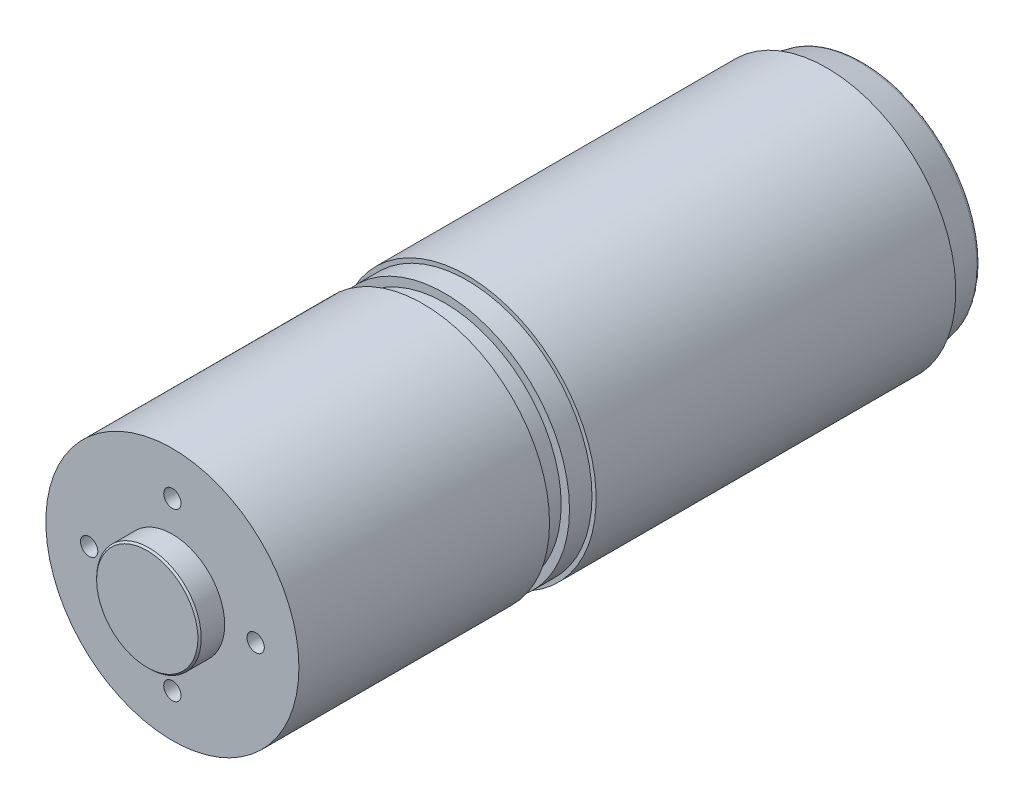
ISO-10303-21;
HEADER;
FILE_DESCRIPTION(('STEP AP214'),'2;1');
FILE_NAME('part.step','',(''),(''),'','','');
FILE_SCHEMA(('AUTOMOTIVE_DESIGN { 1 0 10303 214 1 1 1 1 }'));
ENDSEC;
DATA;
#1=APPLICATION_CONTEXT('core data for automotive mechanical design processes');
#2=APPLICATION_PROTOCOL_DEFINITION('international standard','automotive_design',2000,#1);
#3=PRODUCT_CONTEXT('',#1,'mechanical');
#4=PRODUCT('Part','Part','',(#3));
#5=PRODUCT_RELATED_PRODUCT_CATEGORY('part','',(#4));
#6=PRODUCT_DEFINITION_FORMATION('','',#4);
#7=PRODUCT_DEFINITION_CONTEXT('part definition',#1,'design');
#8=PRODUCT_DEFINITION('design','',#6,#7);
#9=PRODUCT_DEFINITION_SHAPE('','',#8);
#10=(LENGTH_UNIT() NAMED_UNIT(*) SI_UNIT(.MILLI.,.METRE.));
#11=(NAMED_UNIT(*) PLANE_ANGLE_UNIT() SI_UNIT($,.RADIAN.));
#12=(NAMED_UNIT(*) SI_UNIT($,.STERADIAN.) SOLID_ANGLE_UNIT());
#13=UNCERTAINTY_MEASURE_WITH_UNIT(LENGTH_MEASURE(1.E-05),#10,'distance_accuracy_value','');
#14=(GEOMETRIC_REPRESENTATION_CONTEXT(3) GLOBAL_UNCERTAINTY_ASSIGNED_CONTEXT((#13)) GLOBAL_UNIT_ASSIGNED_CONTEXT((#10,
#11,#12)) REPRESENTATION_CONTEXT('',''));
#15=CARTESIAN_POINT('',(0.,0.,0.));
#16=DIRECTION('',(0.,0.,1.));
#17=DIRECTION('',(1.,0.,0.));
#18=AXIS2_PLACEMENT_3D('',#15,#16,#17);
#19=CARTESIAN_POINT('',(0.,0.,42.0624));
#20=DIRECTION('',(0.,0.,-1.));
#21=DIRECTION('',(-1.,0.,0.));
#22=AXIS2_PLACEMENT_3D('',#19,#20,#21);
#23=PLANE('',#22);
#24=CARTESIAN_POINT('',(0.,0.,42.062400000114));
#25=DIRECTION('',(0.,0.,-1.));
#26=DIRECTION('',(-1.,0.,0.));
#27=AXIS2_PLACEMENT_3D('',#24,#25,#26);
#28=CIRCLE('',#27,7.72160000011398);
#29=CARTESIAN_POINT('',(-7.72160000011398,0.,42.062400000114));
#30=VERTEX_POINT('',#29);
#31=EDGE_CURVE('E162',#30,#30,#28,.T.);
#32=ORIENTED_EDGE('',*,*,#31,.F.);
#33=EDGE_LOOP('',(#32));
#34=FACE_BOUND('',#33,.T.);
#35=ADVANCED_FACE('F18',(#34),#23,.F.);
#36=CARTESIAN_POINT('',(12.7,0.,31.877));
#37=DIRECTION('',(0.,0.,1.));
#38=DIRECTION('',(1.,0.,0.));
#39=AXIS2_PLACEMENT_3D('',#36,#37,#38);
#40=CONICAL_SURFACE('',#39,1.3208,1.02974425867665);
#41=CARTESIAN_POINT('',(12.7,0.,31.877));
#42=DIRECTION('',(0.,0.,1.));
#43=DIRECTION('',(1.,0.,0.));
#44=AXIS2_PLACEMENT_3D('',#41,#42,#43);
#45=CIRCLE('',#44,1.3208);
#46=CARTESIAN_POINT('',(14.0208,0.,31.877));
#47=VERTEX_POINT('',#46);
#48=EDGE_CURVE('E161',#47,#47,#45,.T.);
#49=ORIENTED_EDGE('',*,*,#48,.T.);
#50=EDGE_LOOP('',(#49));
#51=FACE_BOUND('',#50,.T.);
#52=CARTESIAN_POINT('',(12.7,0.,31.0833832943884));
#53=VERTEX_POINT('',#52);
#54=VERTEX_LOOP('',#53);
#55=FACE_BOUND('',#54,.T.);
#56=ADVANCED_FACE('F52',(#51,#55),#40,.F.);
#57=CARTESIAN_POINT('',(0.,-12.7,31.877));
#58=DIRECTION('',(0.,0.,1.));
#59=DIRECTION('',(0.,-1.,0.));
#60=AXIS2_PLACEMENT_3D('',#57,#58,#59);
#61=CONICAL_SURFACE('',#60,1.3208,1.02974425867665);
#62=CARTESIAN_POINT('',(0.,-12.7,31.877));
#63=DIRECTION('',(0.,0.,1.));
#64=DIRECTION('',(0.,-1.,0.));
#65=AXIS2_PLACEMENT_3D('',#62,#63,#64);
#66=CIRCLE('',#65,1.3208);
#67=CARTESIAN_POINT('',(0.,-14.0208,31.877));
#68=VERTEX_POINT('',#67);
#69=EDGE_CURVE('E158',#68,#68,#66,.T.);
#70=ORIENTED_EDGE('',*,*,#69,.T.);
#71=EDGE_LOOP('',(#70));
#72=FACE_BOUND('',#71,.T.);
#73=CARTESIAN_POINT('',(0.,-12.7,31.0833832943884));
#74=VERTEX_POINT('',#73);
#75=VERTEX_LOOP('',#74);
#76=FACE_BOUND('',#75,.T.);
#77=ADVANCED_FACE('F54',(#72,#76),#61,.F.);
#78=CARTESIAN_POINT('',(-12.7,0.,31.877));
#79=DIRECTION('',(0.,0.,1.));
#80=DIRECTION('',(1.,0.,0.));
#81=AXIS2_PLACEMENT_3D('',#78,#79,#80);
#82=CONICAL_SURFACE('',#81,1.3208,1.02974425867665);
#83=CARTESIAN_POINT('',(-12.7,0.,31.877));
#84=DIRECTION('',(0.,0.,1.));
#85=DIRECTION('',(1.,0.,0.));
#86=AXIS2_PLACEMENT_3D('',#83,#84,#85);
#87=CIRCLE('',#86,1.3208);
#88=CARTESIAN_POINT('',(-11.3792,0.,31.877));
#89=VERTEX_POINT('',#88);
#90=EDGE_CURVE('E155',#89,#89,#87,.T.);
#91=ORIENTED_EDGE('',*,*,#90,.T.);
#92=EDGE_LOOP('',(#91));
#93=FACE_BOUND('',#92,.T.);
#94=CARTESIAN_POINT('',(-12.7,0.,31.0833832943884));
#95=VERTEX_POINT('',#94);
#96=VERTEX_LOOP('',#95);
#97=FACE_BOUND('',#96,.T.);
#98=ADVANCED_FACE('F62',(#93,#97),#82,.F.);
#99=CARTESIAN_POINT('',(0.,12.7,31.877));
#100=DIRECTION('',(0.,0.,1.));
#101=DIRECTION('',(1.,0.,0.));
#102=AXIS2_PLACEMENT_3D('',#99,#100,#101);
#103=CONICAL_SURFACE('',#102,1.3208,1.02974425867665);
#104=CARTESIAN_POINT('',(0.,12.7,31.877));
#105=DIRECTION('',(0.,0.,1.));
#106=DIRECTION('',(1.,0.,0.));
#107=AXIS2_PLACEMENT_3D('',#104,#105,#106);
#108=CIRCLE('',#107,1.3208);
#109=CARTESIAN_POINT('',(1.3208,12.7,31.877));
#110=VERTEX_POINT('',#109);
#111=EDGE_CURVE('E152',#110,#110,#108,.T.);
#112=ORIENTED_EDGE('',*,*,#111,.T.);
#113=EDGE_LOOP('',(#112));
#114=FACE_BOUND('',#113,.T.);
#115=CARTESIAN_POINT('',(0.,12.7,31.0833832943884));
#116=VERTEX_POINT('',#115);
#117=VERTEX_LOOP('',#116);
#118=FACE_BOUND('',#117,.T.);
#119=ADVANCED_FACE('F366',(#114,#118),#103,.F.);
#120=CARTESIAN_POINT('',(0.,0.,41.808399999886));
#121=DIRECTION('',(0.,0.,-1.));
#122=DIRECTION('',(-1.,0.,0.));
#123=AXIS2_PLACEMENT_3D('',#120,#121,#122);
#124=CONICAL_SURFACE('',#123,7.97559999988603,0.785398162499995);
#125=CARTESIAN_POINT('',(0.,0.,41.8084));
#126=DIRECTION('',(0.,0.,1.));
#127=DIRECTION('',(1.,0.,0.));
#128=AXIS2_PLACEMENT_3D('',#125,#126,#127);
#129=CIRCLE('',#128,7.9756);
#130=CARTESIAN_POINT('',(7.9756,0.,41.8084));
#131=VERTEX_POINT('',#130);
#132=EDGE_CURVE('E143',#131,#131,#129,.F.);
#133=ORIENTED_EDGE('',*,*,#132,.F.);
#134=EDGE_LOOP('',(#133));
#135=FACE_BOUND('',#134,.T.);
#136=ORIENTED_EDGE('',*,*,#31,.T.);
#137=EDGE_LOOP('',(#136));
#138=FACE_BOUND('',#137,.T.);
#139=ADVANCED_FACE('F357',(#135,#138),#124,.T.);
#140=CARTESIAN_POINT('',(12.7,0.,38.227));
#141=DIRECTION('',(0.,0.,-1.));
#142=DIRECTION('',(-1.,0.,0.));
#143=AXIS2_PLACEMENT_3D('',#140,#141,#142);
#144=CYLINDRICAL_SURFACE('',#143,1.3208);
#145=ORIENTED_EDGE('',*,*,#48,.F.);
#146=EDGE_LOOP('',(#145));
#147=FACE_BOUND('',#146,.T.);
#148=CARTESIAN_POINT('',(12.7,0.,38.227));
#149=DIRECTION('',(0.,0.,-1.));
#150=DIRECTION('',(-1.,0.,0.));
#151=AXIS2_PLACEMENT_3D('',#148,#149,#150);
#152=CIRCLE('',#151,1.3208);
#153=CARTESIAN_POINT('',(11.3792,0.,38.227));
#154=VERTEX_POINT('',#153);
#155=EDGE_CURVE('E151',#154,#154,#152,.F.);
#156=ORIENTED_EDGE('',*,*,#155,.T.);
#157=EDGE_LOOP('',(#156));
#158=FACE_BOUND('',#157,.T.);
#159=ADVANCED_FACE('F348',(#147,#158),#144,.F.);
#160=CARTESIAN_POINT('',(0.,-12.7,38.227));
#161=DIRECTION('',(0.,0.,-1.));
#162=DIRECTION('',(-1.,0.,0.));
#163=AXIS2_PLACEMENT_3D('',#160,#161,#162);
#164=CYLINDRICAL_SURFACE('',#163,1.3208);
#165=ORIENTED_EDGE('',*,*,#69,.F.);
#166=EDGE_LOOP('',(#165));
#167=FACE_BOUND('',#166,.T.);
#168=CARTESIAN_POINT('',(0.,-12.7,38.227));
#169=DIRECTION('',(0.,0.,-1.));
#170=DIRECTION('',(-1.,0.,0.));
#171=AXIS2_PLACEMENT_3D('',#168,#169,#170);
#172=CIRCLE('',#171,1.3208);
#173=CARTESIAN_POINT('',(-1.3208,-12.7,38.227));
#174=VERTEX_POINT('',#173);
#175=EDGE_CURVE('E193',#174,#174,#172,.F.);
#176=ORIENTED_EDGE('',*,*,#175,.T.);
#177=EDGE_LOOP('',(#176));
#178=FACE_BOUND('',#177,.T.);
#179=ADVANCED_FACE('F340',(#167,#178),#164,.F.);
#180=CARTESIAN_POINT('',(-12.7,0.,38.227));
#181=DIRECTION('',(0.,0.,-1.));
#182=DIRECTION('',(-1.,0.,0.));
#183=AXIS2_PLACEMENT_3D('',#180,#181,#182);
#184=CYLINDRICAL_SURFACE('',#183,1.3208);
#185=ORIENTED_EDGE('',*,*,#90,.F.);
#186=EDGE_LOOP('',(#185));
#187=FACE_BOUND('',#186,.T.);
#188=CARTESIAN_POINT('',(-12.7,0.,38.227));
#189=DIRECTION('',(0.,0.,-1.));
#190=DIRECTION('',(-1.,0.,0.));
#191=AXIS2_PLACEMENT_3D('',#188,#189,#190);
#192=CIRCLE('',#191,1.3208);
#193=CARTESIAN_POINT('',(-14.0208,0.,38.227));
#194=VERTEX_POINT('',#193);
#195=EDGE_CURVE('E190',#194,#194,#192,.F.);
#196=ORIENTED_EDGE('',*,*,#195,.T.);
#197=EDGE_LOOP('',(#196));
#198=FACE_BOUND('',#197,.T.);
#199=ADVANCED_FACE('F332',(#187,#198),#184,.F.);
#200=CARTESIAN_POINT('',(0.,12.7,38.227));
#201=DIRECTION('',(0.,0.,-1.));
#202=DIRECTION('',(-1.,0.,0.));
#203=AXIS2_PLACEMENT_3D('',#200,#201,#202);
#204=CYLINDRICAL_SURFACE('',#203,1.3208);
#205=ORIENTED_EDGE('',*,*,#111,.F.);
#206=EDGE_LOOP('',(#205));
#207=FACE_BOUND('',#206,.T.);
#208=CARTESIAN_POINT('',(0.,12.7,38.227));
#209=DIRECTION('',(0.,0.,-1.));
#210=DIRECTION('',(-1.,0.,0.));
#211=AXIS2_PLACEMENT_3D('',#208,#209,#210);
#212=CIRCLE('',#211,1.3208);
#213=CARTESIAN_POINT('',(-1.3208,12.7,38.227));
#214=VERTEX_POINT('',#213);
#215=EDGE_CURVE('E187',#214,#214,#212,.F.);
#216=ORIENTED_EDGE('',*,*,#215,.T.);
#217=EDGE_LOOP('',(#216));
#218=FACE_BOUND('',#217,.T.);
#219=ADVANCED_FACE('F20',(#207,#218),#204,.F.);
#220=CARTESIAN_POINT('',(0.,0.,38.227));
#221=DIRECTION('',(0.,0.,1.));
#222=DIRECTION('',(1.,0.,0.));
#223=AXIS2_PLACEMENT_3D('',#220,#221,#222);
#224=CYLINDRICAL_SURFACE('',#223,7.9756);
#225=CARTESIAN_POINT('',(0.,0.,38.227));
#226=DIRECTION('',(0.,0.,1.));
#227=DIRECTION('',(1.,0.,0.));
#228=AXIS2_PLACEMENT_3D('',#225,#226,#227);
#229=CIRCLE('',#228,7.9756);
#230=CARTESIAN_POINT('',(7.9756,0.,38.227));
#231=VERTEX_POINT('',#230);
#232=EDGE_CURVE('E184',#231,#231,#229,.T.);
#233=ORIENTED_EDGE('',*,*,#232,.T.);
#234=EDGE_LOOP('',(#233));
#235=FACE_BOUND('',#234,.T.);
#236=ORIENTED_EDGE('',*,*,#132,.T.);
#237=EDGE_LOOP('',(#236));
#238=FACE_BOUND('',#237,.T.);
#239=ADVANCED_FACE('F315',(#235,#238),#224,.T.);
#240=CARTESIAN_POINT('',(0.,0.,38.227));
#241=DIRECTION('',(0.,0.,-1.));
#242=DIRECTION('',(-1.,0.,0.));
#243=AXIS2_PLACEMENT_3D('',#240,#241,#242);
#244=PLANE('',#243);
#245=ORIENTED_EDGE('',*,*,#232,.F.);
#246=EDGE_LOOP('',(#245));
#247=FACE_BOUND('',#246,.T.);
#248=ORIENTED_EDGE('',*,*,#215,.F.);
#249=EDGE_LOOP('',(#248));
#250=FACE_BOUND('',#249,.T.);
#251=ORIENTED_EDGE('',*,*,#195,.F.);
#252=EDGE_LOOP('',(#251));
#253=FACE_BOUND('',#252,.T.);
#254=ORIENTED_EDGE('',*,*,#175,.F.);
#255=EDGE_LOOP('',(#254));
#256=FACE_BOUND('',#255,.T.);
#257=ORIENTED_EDGE('',*,*,#155,.F.);
#258=EDGE_LOOP('',(#257));
#259=FACE_BOUND('',#258,.T.);
#260=CARTESIAN_POINT('',(0.,0.,38.227));
#261=DIRECTION('',(0.,0.,1.));
#262=DIRECTION('',(1.,0.,0.));
#263=AXIS2_PLACEMENT_3D('',#260,#261,#262);
#264=CIRCLE('',#263,19.304);
#265=CARTESIAN_POINT('',(19.304,0.,38.227));
#266=VERTEX_POINT('',#265);
#267=EDGE_CURVE('E181',#266,#266,#264,.F.);
#268=ORIENTED_EDGE('',*,*,#267,.F.);
#269=EDGE_LOOP('',(#268));
#270=FACE_BOUND('',#269,.T.);
#271=ADVANCED_FACE('F306',(#247,#250,#253,#256,#259,#270),#244,.F.);
#272=CARTESIAN_POINT('',(0.,0.,0.));
#273=DIRECTION('',(0.,0.,1.));
#274=DIRECTION('',(1.,0.,0.));
#275=AXIS2_PLACEMENT_3D('',#272,#273,#274);
#276=CYLINDRICAL_SURFACE('',#275,19.304);
#277=ORIENTED_EDGE('',*,*,#267,.T.);
#278=EDGE_LOOP('',(#277));
#279=FACE_BOUND('',#278,.T.);
#280=CARTESIAN_POINT('',(0.,0.,0.));
#281=DIRECTION('',(0.,0.,1.));
#282=DIRECTION('',(1.,0.,0.));
#283=AXIS2_PLACEMENT_3D('',#280,#281,#282);
#284=CIRCLE('',#283,19.304);
#285=CARTESIAN_POINT('',(19.304,0.,0.));
#286=VERTEX_POINT('',#285);
#287=EDGE_CURVE('E178',#286,#286,#284,.F.);
#288=ORIENTED_EDGE('',*,*,#287,.F.);
#289=EDGE_LOOP('',(#288));
#290=FACE_BOUND('',#289,.T.);
#291=ADVANCED_FACE('F298',(#279,#290),#276,.T.);
#292=CARTESIAN_POINT('',(0.,0.,0.));
#293=DIRECTION('',(0.,0.,-1.));
#294=DIRECTION('',(-1.,0.,0.));
#295=AXIS2_PLACEMENT_3D('',#292,#293,#294);
#296=PLANE('',#295);
#297=CARTESIAN_POINT('',(0.,0.,0.));
#298=DIRECTION('',(0.,0.,-1.));
#299=DIRECTION('',(-1.,0.,0.));
#300=AXIS2_PLACEMENT_3D('',#297,#298,#299);
#301=CIRCLE('',#300,17.78);
#302=CARTESIAN_POINT('',(-17.78,0.,0.));
#303=VERTEX_POINT('',#302);
#304=EDGE_CURVE('E175',#303,#303,#301,.T.);
#305=ORIENTED_EDGE('',*,*,#304,.F.);
#306=EDGE_LOOP('',(#305));
#307=FACE_BOUND('',#306,.T.);
#308=ORIENTED_EDGE('',*,*,#287,.T.);
#309=EDGE_LOOP('',(#308));
#310=FACE_BOUND('',#309,.T.);
#311=ADVANCED_FACE('F290',(#307,#310),#296,.T.);
#312=CARTESIAN_POINT('',(0.,0.,0.));
#313=DIRECTION('',(0.,0.,-1.));
#314=DIRECTION('',(-1.,0.,0.));
#315=AXIS2_PLACEMENT_3D('',#312,#313,#314);
#316=CYLINDRICAL_SURFACE('',#315,17.78);
#317=CARTESIAN_POINT('',(0.,0.,-3.302));
#318=DIRECTION('',(0.,0.,-1.));
#319=DIRECTION('',(-1.,0.,0.));
#320=AXIS2_PLACEMENT_3D('',#317,#318,#319);
#321=CIRCLE('',#320,17.78);
#322=CARTESIAN_POINT('',(-17.78,0.,-3.302));
#323=VERTEX_POINT('',#322);
#324=EDGE_CURVE('E172',#323,#323,#321,.T.);
#325=ORIENTED_EDGE('',*,*,#324,.F.);
#326=EDGE_LOOP('',(#325));
#327=FACE_BOUND('',#326,.T.);
#328=ORIENTED_EDGE('',*,*,#304,.T.);
#329=EDGE_LOOP('',(#328));
#330=FACE_BOUND('',#329,.T.);
#331=ADVANCED_FACE('F128',(#327,#330),#316,.T.);
#332=CARTESIAN_POINT('',(0.,0.,-67.183));
#333=DIRECTION('',(0.,0.,1.));
#334=DIRECTION('',(1.,0.,0.));
#335=AXIS2_PLACEMENT_3D('',#332,#333,#334);
#336=PLANE('',#335);
#337=CARTESIAN_POINT('',(0.,0.,-67.183));
#338=DIRECTION('',(0.,0.,1.));
#339=DIRECTION('',(1.,0.,0.));
#340=AXIS2_PLACEMENT_3D('',#337,#338,#339);
#341=CIRCLE('',#340,17.1717498364017);
#342=CARTESIAN_POINT('',(17.1717498364017,0.,-67.183));
#343=VERTEX_POINT('',#342);
#344=CARTESIAN_POINT('',(-17.1717498364017,0.,-67.183));
#345=VERTEX_POINT('',#344);
#346=EDGE_CURVE('E38',#343,#345,#341,.T.);
#347=ORIENTED_EDGE('',*,*,#346,.F.);
#348=CARTESIAN_POINT('',(0.,0.,-67.183));
#349=DIRECTION('',(0.,0.,1.));
#350=DIRECTION('',(-1.,0.,0.));
#351=AXIS2_PLACEMENT_3D('',#348,#349,#350);
#352=CIRCLE('',#351,17.1717498364017);
#353=EDGE_CURVE('E139',#345,#343,#352,.T.);
#354=ORIENTED_EDGE('',*,*,#353,.F.);
#355=EDGE_LOOP('',(#347,#354));
#356=FACE_BOUND('',#355,.T.);
#357=ADVANCED_FACE('F119',(#356),#336,.F.);
#358=CARTESIAN_POINT('',(0.,0.,-3.302));
#359=DIRECTION('',(0.,0.,1.));
#360=DIRECTION('',(1.,0.,0.));
#361=AXIS2_PLACEMENT_3D('',#358,#359,#360);
#362=PLANE('',#361);
#363=ORIENTED_EDGE('',*,*,#324,.T.);
#364=EDGE_LOOP('',(#363));
#365=FACE_BOUND('',#364,.T.);
#366=CARTESIAN_POINT('',(0.,0.,-3.302));
#367=DIRECTION('',(0.,0.,-1.));
#368=DIRECTION('',(-1.,0.,0.));
#369=AXIS2_PLACEMENT_3D('',#366,#367,#368);
#370=CIRCLE('',#369,19.05);
#371=CARTESIAN_POINT('',(-19.05,0.,-3.302));
#372=VERTEX_POINT('',#371);
#373=EDGE_CURVE('E112',#372,#372,#370,.T.);
#374=ORIENTED_EDGE('',*,*,#373,.F.);
#375=EDGE_LOOP('',(#374));
#376=FACE_BOUND('',#375,.T.);
#377=ADVANCED_FACE('F101',(#365,#376),#362,.T.);
#378=CARTESIAN_POINT('',(0.,0.,-66.421));
#379=DIRECTION('',(0.,0.,1.));
#380=DIRECTION('',(1.,0.,0.));
#381=AXIS2_PLACEMENT_3D('',#378,#379,#380);
#382=TOROIDAL_SURFACE('',#381,17.1717498364017,0.762);
#383=CARTESIAN_POINT('',(0.,0.,-66.5898752810625));
#384=DIRECTION('',(0.,0.,1.));
#385=DIRECTION('',(1.,0.,0.));
#386=AXIS2_PLACEMENT_3D('',#383,#384,#385);
#387=CIRCLE('',#386,17.9148010730768);
#388=CARTESIAN_POINT('',(17.9148010730768,0.,-66.5898752810625));
#389=VERTEX_POINT('',#388);
#390=EDGE_CURVE('E108',#389,#389,#387,.T.);
#391=ORIENTED_EDGE('',*,*,#390,.F.);
#392=EDGE_LOOP('',(#391));
#393=FACE_BOUND('',#392,.T.);
#394=ORIENTED_EDGE('',*,*,#353,.T.);
#395=ORIENTED_EDGE('',*,*,#346,.T.);
#396=EDGE_LOOP('',(#394,#395));
#397=FACE_BOUND('',#396,.T.);
#398=ADVANCED_FACE('F95',(#393,#397),#382,.T.);
#399=CARTESIAN_POINT('',(0.,0.,-3.302));
#400=DIRECTION('',(0.,0.,-1.));
#401=DIRECTION('',(-1.,0.,0.));
#402=AXIS2_PLACEMENT_3D('',#399,#400,#401);
#403=CYLINDRICAL_SURFACE('',#402,19.05);
#404=CARTESIAN_POINT('',(0.,0.,-6.731));
#405=DIRECTION('',(0.,0.,-1.));
#406=DIRECTION('',(-1.,0.,0.));
#407=AXIS2_PLACEMENT_3D('',#404,#405,#406);
#408=CIRCLE('',#407,19.05);
#409=CARTESIAN_POINT('',(-19.05,0.,-6.731));
#410=VERTEX_POINT('',#409);
#411=EDGE_CURVE('E111',#410,#410,#408,.T.);
#412=ORIENTED_EDGE('',*,*,#411,.F.);
#413=EDGE_LOOP('',(#412));
#414=FACE_BOUND('',#413,.T.);
#415=ORIENTED_EDGE('',*,*,#373,.T.);
#416=EDGE_LOOP('',(#415));
#417=FACE_BOUND('',#416,.T.);
#418=ADVANCED_FACE('F92',(#414,#417),#403,.T.);
#419=CARTESIAN_POINT('',(0.,0.,-61.5949999998379));
#420=DIRECTION('',(0.,0.,1.));
#421=DIRECTION('',(0.,-1.,0.));
#422=AXIS2_PLACEMENT_3D('',#419,#420,#421);
#423=CONICAL_SURFACE('',#422,19.0499999992865,0.223476600885274);
#424=CARTESIAN_POINT('',(0.,0.,-61.5949999998379));
#425=DIRECTION('',(0.,0.,1.));
#426=DIRECTION('',(0.,-1.,0.));
#427=AXIS2_PLACEMENT_3D('',#424,#425,#426);
#428=CIRCLE('',#427,19.0499999992865);
#429=CARTESIAN_POINT('',(0.,-19.0499999992865,-61.5949999998379));
#430=VERTEX_POINT('',#429);
#431=EDGE_CURVE('E165',#430,#430,#428,.F.);
#432=ORIENTED_EDGE('',*,*,#431,.T.);
#433=EDGE_LOOP('',(#432));
#434=FACE_BOUND('',#433,.T.);
#435=ORIENTED_EDGE('',*,*,#390,.T.);
#436=EDGE_LOOP('',(#435));
#437=FACE_BOUND('',#436,.T.);
#438=ADVANCED_FACE('F88',(#434,#437),#423,.T.);
#439=CARTESIAN_POINT('',(0.,0.,-6.731));
#440=DIRECTION('',(0.,0.,1.));
#441=DIRECTION('',(1.,0.,0.));
#442=AXIS2_PLACEMENT_3D('',#439,#440,#441);
#443=PLANE('',#442);
#444=ORIENTED_EDGE('',*,*,#411,.T.);
#445=EDGE_LOOP('',(#444));
#446=FACE_BOUND('',#445,.T.);
#447=CARTESIAN_POINT('',(0.,0.,-6.731));
#448=DIRECTION('',(0.,0.,-1.));
#449=DIRECTION('',(-1.,0.,0.));
#450=AXIS2_PLACEMENT_3D('',#447,#448,#449);
#451=CIRCLE('',#450,19.685);
#452=CARTESIAN_POINT('',(-19.685,0.,-6.731));
#453=VERTEX_POINT('',#452);
#454=EDGE_CURVE('E30',#453,#453,#451,.T.);
#455=ORIENTED_EDGE('',*,*,#454,.F.);
#456=EDGE_LOOP('',(#455));
#457=FACE_BOUND('',#456,.T.);
#458=ADVANCED_FACE('F77',(#446,#457),#443,.T.);
#459=CARTESIAN_POINT('',(0.,0.,-61.595));
#460=DIRECTION('',(0.,0.,1.));
#461=DIRECTION('',(1.,0.,0.));
#462=AXIS2_PLACEMENT_3D('',#459,#460,#461);
#463=PLANE('',#462);
#464=ORIENTED_EDGE('',*,*,#431,.F.);
#465=EDGE_LOOP('',(#464));
#466=FACE_BOUND('',#465,.T.);
#467=CARTESIAN_POINT('',(0.,0.,-61.595));
#468=DIRECTION('',(0.,0.,-1.));
#469=DIRECTION('',(-1.,0.,0.));
#470=AXIS2_PLACEMENT_3D('',#467,#468,#469);
#471=CIRCLE('',#470,19.685);
#472=CARTESIAN_POINT('',(-19.685,0.,-61.595));
#473=VERTEX_POINT('',#472);
#474=EDGE_CURVE('E11',#473,#473,#471,.F.);
#475=ORIENTED_EDGE('',*,*,#474,.F.);
#476=EDGE_LOOP('',(#475));
#477=FACE_BOUND('',#476,.T.);
#478=ADVANCED_FACE('F70',(#466,#477),#463,.F.);
#479=CARTESIAN_POINT('',(0.,0.,-6.731));
#480=DIRECTION('',(0.,0.,-1.));
#481=DIRECTION('',(-1.,0.,0.));
#482=AXIS2_PLACEMENT_3D('',#479,#480,#481);
#483=CYLINDRICAL_SURFACE('',#482,19.685);
#484=ORIENTED_EDGE('',*,*,#454,.T.);
#485=EDGE_LOOP('',(#484));
#486=FACE_BOUND('',#485,.T.);
#487=ORIENTED_EDGE('',*,*,#474,.T.);
#488=EDGE_LOOP('',(#487));
#489=FACE_BOUND('',#488,.T.);
#490=ADVANCED_FACE('F68',(#486,#489),#483,.T.);
#491=CLOSED_SHELL('',(#35,#56,#77,#98,#119,#139,#159,#179,#199,#219,#239,#271,#291,#311,#331,
#357,#377,#398,#418,#438,#458,#478,#490));
#492=CARTESIAN_POINT('',(0.,0.,-6.731));
#493=DIRECTION('',(0.,0.,1.));
#494=DIRECTION('',(1.,0.,0.));
#495=AXIS2_PLACEMENT_3D('',#492,#493,#494);
#496=PLANE('',#495);
#497=CARTESIAN_POINT('',(0.,0.,-6.731));
#498=DIRECTION('',(0.,0.,-1.));
#499=DIRECTION('',(-1.,0.,0.));
#500=AXIS2_PLACEMENT_3D('',#497,#498,#499);
#501=CIRCLE('',#500,15.8115);
#502=CARTESIAN_POINT('',(-15.8115,0.,-6.731));
#503=VERTEX_POINT('',#502);
#504=EDGE_CURVE('E203',#503,#503,#501,.T.);
#505=ORIENTED_EDGE('',*,*,#504,.T.);
#506=EDGE_LOOP('',(#505));
#507=FACE_BOUND('',#506,.T.);
#508=ADVANCED_FACE('F83',(#507),#496,.F.);
#509=CARTESIAN_POINT('',(0.,0.,-61.595));
#510=DIRECTION('',(0.,0.,1.));
#511=DIRECTION('',(1.,0.,0.));
#512=AXIS2_PLACEMENT_3D('',#509,#510,#511);
#513=PLANE('',#512);
#514=CARTESIAN_POINT('',(0.,0.,-61.595));
#515=DIRECTION('',(0.,0.,-1.));
#516=DIRECTION('',(-1.,0.,0.));
#517=AXIS2_PLACEMENT_3D('',#514,#515,#516);
#518=CIRCLE('',#517,15.8115);
#519=CARTESIAN_POINT('',(-15.8115,0.,-61.595));
#520=VERTEX_POINT('',#519);
#521=EDGE_CURVE('E200',#520,#520,#518,.F.);
#522=ORIENTED_EDGE('',*,*,#521,.T.);
#523=EDGE_LOOP('',(#522));
#524=FACE_BOUND('',#523,.T.);
#525=ADVANCED_FACE('F210',(#524),#513,.T.);
#526=CARTESIAN_POINT('',(0.,0.,-6.731));
#527=DIRECTION('',(0.,0.,-1.));
#528=DIRECTION('',(-1.,0.,0.));
#529=AXIS2_PLACEMENT_3D('',#526,#527,#528);
#530=CYLINDRICAL_SURFACE('',#529,15.8115);
#531=ORIENTED_EDGE('',*,*,#521,.F.);
#532=EDGE_LOOP('',(#531));
#533=FACE_BOUND('',#532,.T.);
#534=ORIENTED_EDGE('',*,*,#504,.F.);
#535=EDGE_LOOP('',(#534));
#536=FACE_BOUND('',#535,.T.);
#537=ADVANCED_FACE('F208',(#533,#536),#530,.F.);
#538=CLOSED_SHELL('',(#508,#525,#537));
#539=ORIENTED_CLOSED_SHELL('',*,#538,.T.);
#540=BREP_WITH_VOIDS('B1',#491,(#539));
#541=ADVANCED_BREP_SHAPE_REPRESENTATION('',(#18,#540),#14);
#542=SHAPE_DEFINITION_REPRESENTATION(#9,#541);
ENDSEC;
END-ISO-10303-21;
